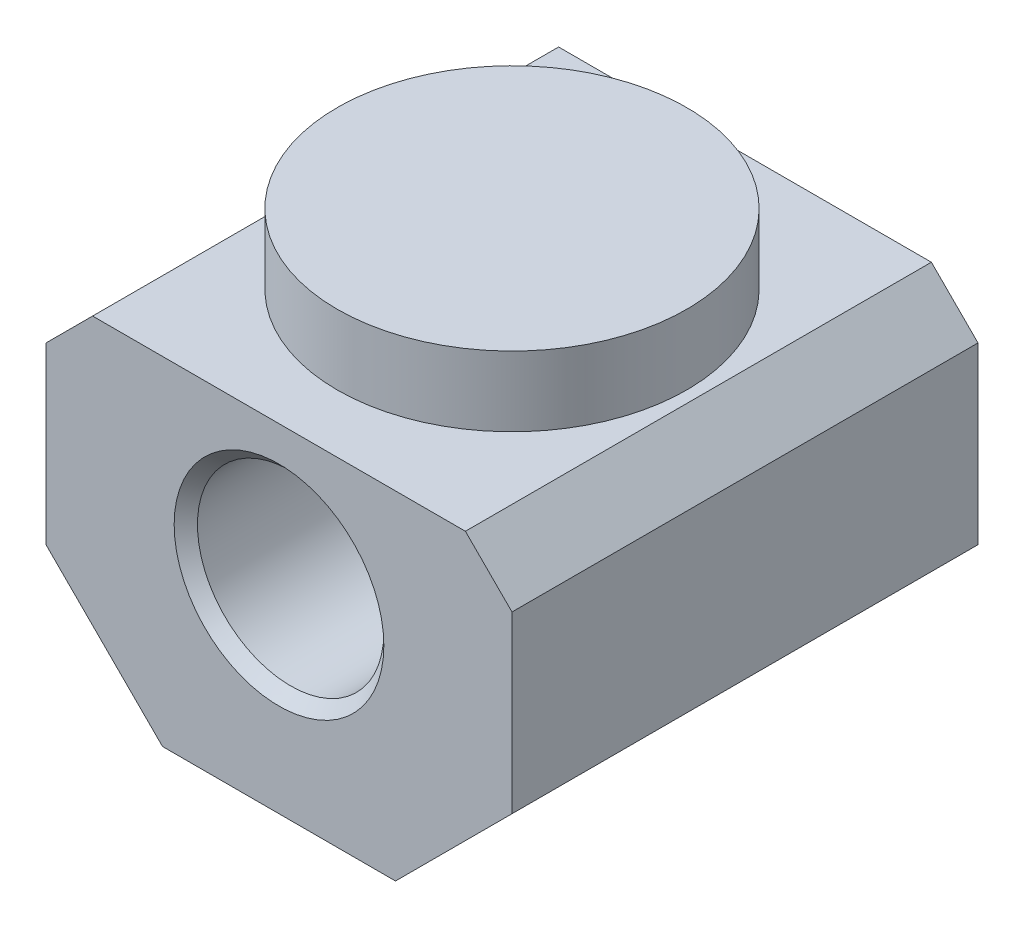
ISO-10303-21;
HEADER;
FILE_DESCRIPTION(('STEP AP214'),'2;1');
FILE_NAME('part.step','',(''),(''),'','','');
FILE_SCHEMA(('AUTOMOTIVE_DESIGN { 1 0 10303 214 1 1 1 1 }'));
ENDSEC;
DATA;
#1=APPLICATION_CONTEXT('core data for automotive mechanical design processes');
#2=APPLICATION_PROTOCOL_DEFINITION('international standard','automotive_design',2000,#1);
#3=PRODUCT_CONTEXT('',#1,'mechanical');
#4=PRODUCT('Part','Part','',(#3));
#5=PRODUCT_RELATED_PRODUCT_CATEGORY('part','',(#4));
#6=PRODUCT_DEFINITION_FORMATION('','',#4);
#7=PRODUCT_DEFINITION_CONTEXT('part definition',#1,'design');
#8=PRODUCT_DEFINITION('design','',#6,#7);
#9=PRODUCT_DEFINITION_SHAPE('','',#8);
#10=(LENGTH_UNIT() NAMED_UNIT(*) SI_UNIT(.MILLI.,.METRE.));
#11=(NAMED_UNIT(*) PLANE_ANGLE_UNIT() SI_UNIT($,.RADIAN.));
#12=(NAMED_UNIT(*) SI_UNIT($,.STERADIAN.) SOLID_ANGLE_UNIT());
#13=UNCERTAINTY_MEASURE_WITH_UNIT(LENGTH_MEASURE(1.E-05),#10,'distance_accuracy_value','');
#14=(GEOMETRIC_REPRESENTATION_CONTEXT(3) GLOBAL_UNCERTAINTY_ASSIGNED_CONTEXT((#13)) GLOBAL_UNIT_ASSIGNED_CONTEXT((#10,
#11,#12)) REPRESENTATION_CONTEXT('',''));
#15=CARTESIAN_POINT('',(0.,0.,0.));
#16=DIRECTION('',(0.,0.,1.));
#17=DIRECTION('',(1.,0.,0.));
#18=AXIS2_PLACEMENT_3D('',#15,#16,#17);
#19=CARTESIAN_POINT('',(10.,-14.5,10.));
#20=DIRECTION('',(1.,0.,0.));
#21=DIRECTION('',(0.,0.,-1.));
#22=AXIS2_PLACEMENT_3D('',#19,#20,#21);
#23=PLANE('',#22);
#24=DIRECTION('',(0.,1.,0.));
#25=VECTOR('',#24,1.);
#26=CARTESIAN_POINT('',(10.,-14.5,-10.));
#27=LINE('',#26,#25);
#28=CARTESIAN_POINT('',(10.,-9.50000000000001,-10.));
#29=VERTEX_POINT('',#28);
#30=CARTESIAN_POINT('',(10.,-2.00000000000001,-10.));
#31=VERTEX_POINT('',#30);
#32=EDGE_CURVE('E129',#29,#31,#27,.T.);
#33=ORIENTED_EDGE('',*,*,#32,.T.);
#34=DIRECTION('',(0.,0.,1.));
#35=VECTOR('',#34,1.);
#36=CARTESIAN_POINT('',(10.,-2.00000000000001,10.));
#37=LINE('',#36,#35);
#38=CARTESIAN_POINT('',(10.,-2.00000000000001,10.));
#39=VERTEX_POINT('',#38);
#40=EDGE_CURVE('E120',#31,#39,#37,.T.);
#41=ORIENTED_EDGE('',*,*,#40,.T.);
#42=DIRECTION('',(0.,1.,0.));
#43=VECTOR('',#42,1.);
#44=CARTESIAN_POINT('',(10.,-14.5,10.));
#45=LINE('',#44,#43);
#46=CARTESIAN_POINT('',(10.,-9.50000000000001,10.));
#47=VERTEX_POINT('',#46);
#48=EDGE_CURVE('E106',#47,#39,#45,.T.);
#49=ORIENTED_EDGE('',*,*,#48,.F.);
#50=DIRECTION('',(0.,0.,-1.));
#51=VECTOR('',#50,1.);
#52=CARTESIAN_POINT('',(10.,-9.50000000000001,-10.));
#53=LINE('',#52,#51);
#54=EDGE_CURVE('E118',#47,#29,#53,.T.);
#55=ORIENTED_EDGE('',*,*,#54,.T.);
#56=EDGE_LOOP('',(#33,#41,#49,#55));
#57=FACE_BOUND('',#56,.T.);
#58=ADVANCED_FACE('F33',(#57),#23,.T.);
#59=CARTESIAN_POINT('',(-10.,-14.5,10.));
#60=DIRECTION('',(0.,0.,1.));
#61=DIRECTION('',(1.,0.,0.));
#62=AXIS2_PLACEMENT_3D('',#59,#60,#61);
#63=PLANE('',#62);
#64=CARTESIAN_POINT('',(0.,-6.,10.));
#65=DIRECTION('',(0.,0.,1.));
#66=DIRECTION('',(1.,0.,0.));
#67=AXIS2_PLACEMENT_3D('',#64,#65,#66);
#68=CIRCLE('',#67,4.49999999999993);
#69=CARTESIAN_POINT('',(4.49999999999993,-6.,10.));
#70=VERTEX_POINT('',#69);
#71=EDGE_CURVE('E41',#70,#70,#68,.F.);
#72=ORIENTED_EDGE('',*,*,#71,.T.);
#73=EDGE_LOOP('',(#72));
#74=FACE_BOUND('',#73,.T.);
#75=DIRECTION('',(1.,0.,0.));
#76=VECTOR('',#75,1.);
#77=CARTESIAN_POINT('',(-10.,0.,10.));
#78=LINE('',#77,#76);
#79=CARTESIAN_POINT('',(-8.00000000000001,0.,10.));
#80=VERTEX_POINT('',#79);
#81=CARTESIAN_POINT('',(8.00000000000001,0.,10.));
#82=VERTEX_POINT('',#81);
#83=EDGE_CURVE('E198',#80,#82,#78,.T.);
#84=ORIENTED_EDGE('',*,*,#83,.F.);
#85=DIRECTION('',(0.707106781186544,0.707106781186551,0.));
#86=VECTOR('',#85,1.);
#87=CARTESIAN_POINT('',(-16.25,-8.25000000000006,10.));
#88=LINE('',#87,#86);
#89=CARTESIAN_POINT('',(-10.,-2.00000000000001,10.));
#90=VERTEX_POINT('',#89);
#91=EDGE_CURVE('E148',#80,#90,#88,.F.);
#92=ORIENTED_EDGE('',*,*,#91,.T.);
#93=DIRECTION('',(0.,1.,0.));
#94=VECTOR('',#93,1.);
#95=CARTESIAN_POINT('',(-10.,-14.5,10.));
#96=LINE('',#95,#94);
#97=CARTESIAN_POINT('',(-10.,-9.50000000000001,10.));
#98=VERTEX_POINT('',#97);
#99=EDGE_CURVE('E121',#98,#90,#96,.T.);
#100=ORIENTED_EDGE('',*,*,#99,.F.);
#101=DIRECTION('',(0.70710678118655,-0.707106781186545,0.));
#102=VECTOR('',#101,1.);
#103=CARTESIAN_POINT('',(-7.50000000000001,-12.,10.));
#104=LINE('',#103,#102);
#105=CARTESIAN_POINT('',(-4.99999999999998,-14.5,10.));
#106=VERTEX_POINT('',#105);
#107=EDGE_CURVE('E114',#98,#106,#104,.T.);
#108=ORIENTED_EDGE('',*,*,#107,.T.);
#109=DIRECTION('',(1.,0.,0.));
#110=VECTOR('',#109,1.);
#111=CARTESIAN_POINT('',(-10.,-14.5,10.));
#112=LINE('',#111,#110);
#113=CARTESIAN_POINT('',(4.99999999999998,-14.5,10.));
#114=VERTEX_POINT('',#113);
#115=EDGE_CURVE('E109',#106,#114,#112,.T.);
#116=ORIENTED_EDGE('',*,*,#115,.T.);
#117=DIRECTION('',(0.70710678118655,0.707106781186545,0.));
#118=VECTOR('',#117,1.);
#119=CARTESIAN_POINT('',(-2.50000000000006,-22.,10.));
#120=LINE('',#119,#118);
#121=EDGE_CURVE('E102',#114,#47,#120,.T.);
#122=ORIENTED_EDGE('',*,*,#121,.T.);
#123=ORIENTED_EDGE('',*,*,#48,.T.);
#124=DIRECTION('',(0.707106781186544,-0.707106781186551,0.));
#125=VECTOR('',#124,1.);
#126=CARTESIAN_POINT('',(6.25000000000009,1.74999999999994,10.));
#127=LINE('',#126,#125);
#128=EDGE_CURVE('E146',#39,#82,#127,.F.);
#129=ORIENTED_EDGE('',*,*,#128,.T.);
#130=EDGE_LOOP('',(#84,#92,#100,#108,#116,#122,#123,#129));
#131=FACE_BOUND('',#130,.T.);
#132=ADVANCED_FACE('F105',(#74,#131),#63,.T.);
#133=CARTESIAN_POINT('',(-10.,-14.5,-10.));
#134=DIRECTION('',(-1.,0.,0.));
#135=DIRECTION('',(0.,0.,1.));
#136=AXIS2_PLACEMENT_3D('',#133,#134,#135);
#137=PLANE('',#136);
#138=ORIENTED_EDGE('',*,*,#99,.T.);
#139=DIRECTION('',(0.,0.,-1.));
#140=VECTOR('',#139,1.);
#141=CARTESIAN_POINT('',(-10.,-2.00000000000001,-10.));
#142=LINE('',#141,#140);
#143=CARTESIAN_POINT('',(-10.,-2.00000000000001,-10.));
#144=VERTEX_POINT('',#143);
#145=EDGE_CURVE('E56',#90,#144,#142,.T.);
#146=ORIENTED_EDGE('',*,*,#145,.T.);
#147=DIRECTION('',(0.,1.,0.));
#148=VECTOR('',#147,1.);
#149=CARTESIAN_POINT('',(-10.,-14.5,-10.));
#150=LINE('',#149,#148);
#151=CARTESIAN_POINT('',(-10.,-9.50000000000001,-10.));
#152=VERTEX_POINT('',#151);
#153=EDGE_CURVE('E186',#152,#144,#150,.T.);
#154=ORIENTED_EDGE('',*,*,#153,.F.);
#155=DIRECTION('',(0.,0.,1.));
#156=VECTOR('',#155,1.);
#157=CARTESIAN_POINT('',(-10.,-9.50000000000001,10.));
#158=LINE('',#157,#156);
#159=EDGE_CURVE('E113',#152,#98,#158,.T.);
#160=ORIENTED_EDGE('',*,*,#159,.T.);
#161=EDGE_LOOP('',(#138,#146,#154,#160));
#162=FACE_BOUND('',#161,.T.);
#163=ADVANCED_FACE('F184',(#162),#137,.T.);
#164=CARTESIAN_POINT('',(10.,-14.5,-10.));
#165=DIRECTION('',(0.,0.,-1.));
#166=DIRECTION('',(-1.,0.,0.));
#167=AXIS2_PLACEMENT_3D('',#164,#165,#166);
#168=PLANE('',#167);
#169=CARTESIAN_POINT('',(0.,-6.,-10.));
#170=DIRECTION('',(0.,0.,-1.));
#171=DIRECTION('',(-1.,0.,0.));
#172=AXIS2_PLACEMENT_3D('',#169,#170,#171);
#173=CIRCLE('',#172,4.49999999999993);
#174=CARTESIAN_POINT('',(-4.49999999999993,-6.,-10.));
#175=VERTEX_POINT('',#174);
#176=EDGE_CURVE('E11',#175,#175,#173,.F.);
#177=ORIENTED_EDGE('',*,*,#176,.T.);
#178=EDGE_LOOP('',(#177));
#179=FACE_BOUND('',#178,.T.);
#180=ORIENTED_EDGE('',*,*,#153,.T.);
#181=DIRECTION('',(-0.707106781186544,-0.707106781186551,0.));
#182=VECTOR('',#181,1.);
#183=CARTESIAN_POINT('',(-6.25000000000009,1.74999999999994,-10.));
#184=LINE('',#183,#182);
#185=CARTESIAN_POINT('',(-8.00000000000001,0.,-10.));
#186=VERTEX_POINT('',#185);
#187=EDGE_CURVE('E152',#144,#186,#184,.F.);
#188=ORIENTED_EDGE('',*,*,#187,.T.);
#189=DIRECTION('',(-1.,0.,0.));
#190=VECTOR('',#189,1.);
#191=CARTESIAN_POINT('',(10.,0.,-10.));
#192=LINE('',#191,#190);
#193=CARTESIAN_POINT('',(8.00000000000001,0.,-10.));
#194=VERTEX_POINT('',#193);
#195=EDGE_CURVE('E200',#194,#186,#192,.T.);
#196=ORIENTED_EDGE('',*,*,#195,.F.);
#197=DIRECTION('',(-0.707106781186544,0.707106781186551,0.));
#198=VECTOR('',#197,1.);
#199=CARTESIAN_POINT('',(16.25,-8.25000000000006,-10.));
#200=LINE('',#199,#198);
#201=EDGE_CURVE('E48',#194,#31,#200,.F.);
#202=ORIENTED_EDGE('',*,*,#201,.T.);
#203=ORIENTED_EDGE('',*,*,#32,.F.);
#204=DIRECTION('',(-0.70710678118655,-0.707106781186545,0.));
#205=VECTOR('',#204,1.);
#206=CARTESIAN_POINT('',(7.50000000000001,-12.,-10.));
#207=LINE('',#206,#205);
#208=CARTESIAN_POINT('',(4.99999999999998,-14.5,-10.));
#209=VERTEX_POINT('',#208);
#210=EDGE_CURVE('E124',#29,#209,#207,.T.);
#211=ORIENTED_EDGE('',*,*,#210,.T.);
#212=DIRECTION('',(-1.,0.,0.));
#213=VECTOR('',#212,1.);
#214=CARTESIAN_POINT('',(10.,-14.5,-10.));
#215=LINE('',#214,#213);
#216=CARTESIAN_POINT('',(-4.99999999999998,-14.5,-10.));
#217=VERTEX_POINT('',#216);
#218=EDGE_CURVE('E202',#209,#217,#215,.T.);
#219=ORIENTED_EDGE('',*,*,#218,.T.);
#220=DIRECTION('',(-0.70710678118655,0.707106781186545,0.));
#221=VECTOR('',#220,1.);
#222=CARTESIAN_POINT('',(2.50000000000006,-22.,-10.));
#223=LINE('',#222,#221);
#224=EDGE_CURVE('E125',#217,#152,#223,.T.);
#225=ORIENTED_EDGE('',*,*,#224,.T.);
#226=EDGE_LOOP('',(#180,#188,#196,#202,#203,#211,#219,#225));
#227=FACE_BOUND('',#226,.T.);
#228=ADVANCED_FACE('F181',(#179,#227),#168,.T.);
#229=CARTESIAN_POINT('',(0.,-14.5,0.));
#230=DIRECTION('',(0.,1.,0.));
#231=DIRECTION('',(0.,0.,1.));
#232=AXIS2_PLACEMENT_3D('',#229,#230,#231);
#233=PLANE('',#232);
#234=ORIENTED_EDGE('',*,*,#218,.F.);
#235=DIRECTION('',(0.,0.,1.));
#236=VECTOR('',#235,1.);
#237=CARTESIAN_POINT('',(4.99999999999998,-14.5,10.));
#238=LINE('',#237,#236);
#239=EDGE_CURVE('E135',#209,#114,#238,.T.);
#240=ORIENTED_EDGE('',*,*,#239,.T.);
#241=ORIENTED_EDGE('',*,*,#115,.F.);
#242=DIRECTION('',(0.,0.,-1.));
#243=VECTOR('',#242,1.);
#244=CARTESIAN_POINT('',(-4.99999999999998,-14.5,-10.));
#245=LINE('',#244,#243);
#246=EDGE_CURVE('E133',#106,#217,#245,.T.);
#247=ORIENTED_EDGE('',*,*,#246,.T.);
#248=EDGE_LOOP('',(#234,#240,#241,#247));
#249=FACE_BOUND('',#248,.T.);
#250=ADVANCED_FACE('F183',(#249),#233,.F.);
#251=CARTESIAN_POINT('',(0.,0.,0.));
#252=DIRECTION('',(0.,1.,0.));
#253=DIRECTION('',(0.,0.,1.));
#254=AXIS2_PLACEMENT_3D('',#251,#252,#253);
#255=PLANE('',#254);
#256=CARTESIAN_POINT('',(0.,0.,0.));
#257=DIRECTION('',(0.,1.,0.));
#258=DIRECTION('',(0.,0.,1.));
#259=AXIS2_PLACEMENT_3D('',#256,#257,#258);
#260=CIRCLE('',#259,7.5);
#261=CARTESIAN_POINT('',(0.,0.,7.5));
#262=VERTEX_POINT('',#261);
#263=EDGE_CURVE('E246',#262,#262,#260,.T.);
#264=ORIENTED_EDGE('',*,*,#263,.F.);
#265=EDGE_LOOP('',(#264));
#266=FACE_BOUND('',#265,.T.);
#267=ORIENTED_EDGE('',*,*,#195,.T.);
#268=DIRECTION('',(0.,0.,1.));
#269=VECTOR('',#268,1.);
#270=CARTESIAN_POINT('',(-8.00000000000001,0.,0.));
#271=LINE('',#270,#269);
#272=EDGE_CURVE('E143',#186,#80,#271,.T.);
#273=ORIENTED_EDGE('',*,*,#272,.T.);
#274=ORIENTED_EDGE('',*,*,#83,.T.);
#275=DIRECTION('',(0.,0.,-1.));
#276=VECTOR('',#275,1.);
#277=CARTESIAN_POINT('',(8.00000000000001,0.,0.));
#278=LINE('',#277,#276);
#279=EDGE_CURVE('E140',#82,#194,#278,.T.);
#280=ORIENTED_EDGE('',*,*,#279,.T.);
#281=EDGE_LOOP('',(#267,#273,#274,#280));
#282=FACE_BOUND('',#281,.T.);
#283=ADVANCED_FACE('F197',(#266,#282),#255,.T.);
#284=CARTESIAN_POINT('',(0.,3.,0.));
#285=DIRECTION('',(0.,-1.,0.));
#286=DIRECTION('',(0.,0.,-1.));
#287=AXIS2_PLACEMENT_3D('',#284,#285,#286);
#288=CYLINDRICAL_SURFACE('',#287,7.5);
#289=CARTESIAN_POINT('',(0.,3.,0.));
#290=DIRECTION('',(0.,1.,0.));
#291=DIRECTION('',(0.,0.,1.));
#292=AXIS2_PLACEMENT_3D('',#289,#290,#291);
#293=CIRCLE('',#292,7.5);
#294=CARTESIAN_POINT('',(0.,3.,7.5));
#295=VERTEX_POINT('',#294);
#296=EDGE_CURVE('E205',#295,#295,#293,.T.);
#297=ORIENTED_EDGE('',*,*,#296,.F.);
#298=EDGE_LOOP('',(#297));
#299=FACE_BOUND('',#298,.T.);
#300=ORIENTED_EDGE('',*,*,#263,.T.);
#301=EDGE_LOOP('',(#300));
#302=FACE_BOUND('',#301,.T.);
#303=ADVANCED_FACE('F233',(#299,#302),#288,.T.);
#304=CARTESIAN_POINT('',(0.,3.,0.));
#305=DIRECTION('',(0.,1.,0.));
#306=DIRECTION('',(0.,0.,1.));
#307=AXIS2_PLACEMENT_3D('',#304,#305,#306);
#308=PLANE('',#307);
#309=ORIENTED_EDGE('',*,*,#296,.T.);
#310=EDGE_LOOP('',(#309));
#311=FACE_BOUND('',#310,.T.);
#312=ADVANCED_FACE('F173',(#311),#308,.T.);
#313=CARTESIAN_POINT('',(0.,-6.,10.));
#314=DIRECTION('',(0.,0.,1.));
#315=DIRECTION('',(1.,0.,0.));
#316=AXIS2_PLACEMENT_3D('',#313,#314,#315);
#317=CYLINDRICAL_SURFACE('',#316,3.99999999999999);
#318=CARTESIAN_POINT('',(0.,-6.,9.50000000000005));
#319=DIRECTION('',(0.,0.,1.));
#320=DIRECTION('',(1.,0.,0.));
#321=AXIS2_PLACEMENT_3D('',#318,#319,#320);
#322=CIRCLE('',#321,3.99999999999999);
#323=CARTESIAN_POINT('',(3.99999999999999,-6.,9.50000000000005));
#324=VERTEX_POINT('',#323);
#325=EDGE_CURVE('E158',#324,#324,#322,.T.);
#326=ORIENTED_EDGE('',*,*,#325,.T.);
#327=EDGE_LOOP('',(#326));
#328=FACE_BOUND('',#327,.T.);
#329=CARTESIAN_POINT('',(0.,-6.,-9.50000000000006));
#330=DIRECTION('',(0.,0.,-1.));
#331=DIRECTION('',(-1.,0.,0.));
#332=AXIS2_PLACEMENT_3D('',#329,#330,#331);
#333=CIRCLE('',#332,3.99999999999999);
#334=CARTESIAN_POINT('',(-3.99999999999999,-6.,-9.50000000000006));
#335=VERTEX_POINT('',#334);
#336=EDGE_CURVE('E155',#335,#335,#333,.T.);
#337=ORIENTED_EDGE('',*,*,#336,.T.);
#338=EDGE_LOOP('',(#337));
#339=FACE_BOUND('',#338,.T.);
#340=ADVANCED_FACE('F170',(#328,#339),#317,.F.);
#341=CARTESIAN_POINT('',(10.,-9.50000000000001,10.));
#342=DIRECTION('',(0.707106781186545,-0.70710678118655,0.));
#343=DIRECTION('',(0.,0.,1.));
#344=AXIS2_PLACEMENT_3D('',#341,#342,#343);
#345=PLANE('',#344);
#346=ORIENTED_EDGE('',*,*,#121,.F.);
#347=ORIENTED_EDGE('',*,*,#239,.F.);
#348=ORIENTED_EDGE('',*,*,#210,.F.);
#349=ORIENTED_EDGE('',*,*,#54,.F.);
#350=EDGE_LOOP('',(#346,#347,#348,#349));
#351=FACE_BOUND('',#350,.T.);
#352=ADVANCED_FACE('F123',(#351),#345,.T.);
#353=CARTESIAN_POINT('',(-10.,-9.50000000000001,-10.));
#354=DIRECTION('',(-0.707106781186545,-0.70710678118655,0.));
#355=DIRECTION('',(0.,0.,-1.));
#356=AXIS2_PLACEMENT_3D('',#353,#354,#355);
#357=PLANE('',#356);
#358=ORIENTED_EDGE('',*,*,#224,.F.);
#359=ORIENTED_EDGE('',*,*,#246,.F.);
#360=ORIENTED_EDGE('',*,*,#107,.F.);
#361=ORIENTED_EDGE('',*,*,#159,.F.);
#362=EDGE_LOOP('',(#358,#359,#360,#361));
#363=FACE_BOUND('',#362,.T.);
#364=ADVANCED_FACE('F213',(#363),#357,.T.);
#365=CARTESIAN_POINT('',(-8.00000000000001,0.,0.));
#366=DIRECTION('',(0.707106781186551,-0.707106781186544,0.));
#367=DIRECTION('',(0.,0.,1.));
#368=AXIS2_PLACEMENT_3D('',#365,#366,#367);
#369=PLANE('',#368);
#370=ORIENTED_EDGE('',*,*,#187,.F.);
#371=ORIENTED_EDGE('',*,*,#145,.F.);
#372=ORIENTED_EDGE('',*,*,#91,.F.);
#373=ORIENTED_EDGE('',*,*,#272,.F.);
#374=EDGE_LOOP('',(#370,#371,#372,#373));
#375=FACE_BOUND('',#374,.T.);
#376=ADVANCED_FACE('F194',(#375),#369,.F.);
#377=CARTESIAN_POINT('',(8.00000000000001,0.,0.));
#378=DIRECTION('',(-0.707106781186551,-0.707106781186544,0.));
#379=DIRECTION('',(0.,0.,-1.));
#380=AXIS2_PLACEMENT_3D('',#377,#378,#379);
#381=PLANE('',#380);
#382=ORIENTED_EDGE('',*,*,#128,.F.);
#383=ORIENTED_EDGE('',*,*,#40,.F.);
#384=ORIENTED_EDGE('',*,*,#201,.F.);
#385=ORIENTED_EDGE('',*,*,#279,.F.);
#386=EDGE_LOOP('',(#382,#383,#384,#385));
#387=FACE_BOUND('',#386,.T.);
#388=ADVANCED_FACE('F167',(#387),#381,.F.);
#389=CARTESIAN_POINT('',(0.,-6.,9.50000000000005));
#390=DIRECTION('',(0.,0.,1.));
#391=DIRECTION('',(1.,0.,0.));
#392=AXIS2_PLACEMENT_3D('',#389,#390,#391);
#393=CONICAL_SURFACE('',#392,3.99999999999999,0.785398163397449);
#394=ORIENTED_EDGE('',*,*,#71,.F.);
#395=EDGE_LOOP('',(#394));
#396=FACE_BOUND('',#395,.T.);
#397=ORIENTED_EDGE('',*,*,#325,.F.);
#398=EDGE_LOOP('',(#397));
#399=FACE_BOUND('',#398,.T.);
#400=ADVANCED_FACE('F164',(#396,#399),#393,.F.);
#401=CARTESIAN_POINT('',(0.,-6.,-10.));
#402=DIRECTION('',(0.,0.,-1.));
#403=DIRECTION('',(-1.,0.,0.));
#404=AXIS2_PLACEMENT_3D('',#401,#402,#403);
#405=CONICAL_SURFACE('',#404,4.49999999999993,0.785398163397444);
#406=ORIENTED_EDGE('',*,*,#336,.F.);
#407=EDGE_LOOP('',(#406));
#408=FACE_BOUND('',#407,.T.);
#409=ORIENTED_EDGE('',*,*,#176,.F.);
#410=EDGE_LOOP('',(#409));
#411=FACE_BOUND('',#410,.T.);
#412=ADVANCED_FACE('F35',(#408,#411),#405,.F.);
#413=CLOSED_SHELL('',(#58,#132,#163,#228,#250,#283,#303,#312,#340,#352,#364,#376,#388,#400,#412));
#414=MANIFOLD_SOLID_BREP('B2',#413);
#415=ADVANCED_BREP_SHAPE_REPRESENTATION('',(#18,#414),#14);
#416=SHAPE_DEFINITION_REPRESENTATION(#9,#415);
ENDSEC;
END-ISO-10303-21;
